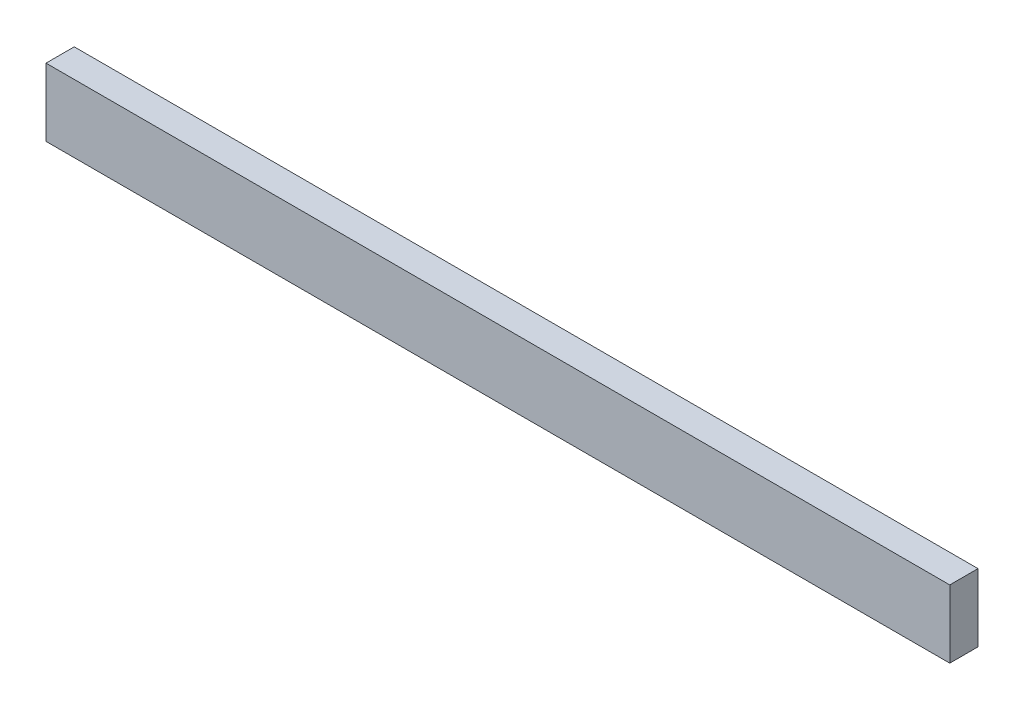
ISO-10303-21;
HEADER;
FILE_DESCRIPTION(('STEP AP214'),'2;1');
FILE_NAME('part.step','',(''),(''),'','','');
FILE_SCHEMA(('AUTOMOTIVE_DESIGN { 1 0 10303 214 1 1 1 1 }'));
ENDSEC;
DATA;
#1=APPLICATION_CONTEXT('core data for automotive mechanical design processes');
#2=APPLICATION_PROTOCOL_DEFINITION('international standard','automotive_design',2000,#1);
#3=PRODUCT_CONTEXT('',#1,'mechanical');
#4=PRODUCT('Part','Part','',(#3));
#5=PRODUCT_RELATED_PRODUCT_CATEGORY('part','',(#4));
#6=PRODUCT_DEFINITION_FORMATION('','',#4);
#7=PRODUCT_DEFINITION_CONTEXT('part definition',#1,'design');
#8=PRODUCT_DEFINITION('design','',#6,#7);
#9=PRODUCT_DEFINITION_SHAPE('','',#8);
#10=(LENGTH_UNIT() NAMED_UNIT(*) SI_UNIT(.MILLI.,.METRE.));
#11=(NAMED_UNIT(*) PLANE_ANGLE_UNIT() SI_UNIT($,.RADIAN.));
#12=(NAMED_UNIT(*) SI_UNIT($,.STERADIAN.) SOLID_ANGLE_UNIT());
#13=UNCERTAINTY_MEASURE_WITH_UNIT(LENGTH_MEASURE(1.E-05),#10,'distance_accuracy_value','');
#14=(GEOMETRIC_REPRESENTATION_CONTEXT(3) GLOBAL_UNCERTAINTY_ASSIGNED_CONTEXT((#13)) GLOBAL_UNIT_ASSIGNED_CONTEXT((#10,
#11,#12)) REPRESENTATION_CONTEXT('',''));
#15=CARTESIAN_POINT('',(0.,0.,0.));
#16=DIRECTION('',(0.,0.,1.));
#17=DIRECTION('',(1.,0.,0.));
#18=AXIS2_PLACEMENT_3D('',#15,#16,#17);
#19=CARTESIAN_POINT('',(0.,0.,25.));
#20=DIRECTION('',(1.,0.,0.));
#21=DIRECTION('',(0.,0.,-1.));
#22=AXIS2_PLACEMENT_3D('',#19,#20,#21);
#23=PLANE('',#22);
#24=DIRECTION('',(0.,-1.,0.));
#25=VECTOR('',#24,1.);
#26=CARTESIAN_POINT('',(0.,0.,0.));
#27=LINE('',#26,#25);
#28=CARTESIAN_POINT('',(0.,60.,0.));
#29=VERTEX_POINT('',#28);
#30=CARTESIAN_POINT('',(0.,0.,0.));
#31=VERTEX_POINT('',#30);
#32=EDGE_CURVE('E95',#29,#31,#27,.T.);
#33=ORIENTED_EDGE('',*,*,#32,.T.);
#34=DIRECTION('',(0.,0.,-1.));
#35=VECTOR('',#34,1.);
#36=CARTESIAN_POINT('',(0.,0.,25.));
#37=LINE('',#36,#35);
#38=CARTESIAN_POINT('',(0.,0.,25.));
#39=VERTEX_POINT('',#38);
#40=EDGE_CURVE('E11',#39,#31,#37,.T.);
#41=ORIENTED_EDGE('',*,*,#40,.F.);
#42=DIRECTION('',(0.,-1.,0.));
#43=VECTOR('',#42,1.);
#44=CARTESIAN_POINT('',(0.,0.,25.));
#45=LINE('',#44,#43);
#46=CARTESIAN_POINT('',(0.,60.,25.));
#47=VERTEX_POINT('',#46);
#48=EDGE_CURVE('E83',#47,#39,#45,.T.);
#49=ORIENTED_EDGE('',*,*,#48,.F.);
#50=DIRECTION('',(0.,0.,-1.));
#51=VECTOR('',#50,1.);
#52=CARTESIAN_POINT('',(0.,60.,25.));
#53=LINE('',#52,#51);
#54=EDGE_CURVE('E91',#47,#29,#53,.T.);
#55=ORIENTED_EDGE('',*,*,#54,.T.);
#56=EDGE_LOOP('',(#33,#41,#49,#55));
#57=FACE_BOUND('',#56,.T.);
#58=ADVANCED_FACE('F32',(#57),#23,.F.);
#59=CARTESIAN_POINT('',(0.,0.,25.));
#60=DIRECTION('',(0.,1.,0.));
#61=DIRECTION('',(0.,0.,1.));
#62=AXIS2_PLACEMENT_3D('',#59,#60,#61);
#63=PLANE('',#62);
#64=DIRECTION('',(1.,0.,0.));
#65=VECTOR('',#64,1.);
#66=CARTESIAN_POINT('',(0.,0.,0.));
#67=LINE('',#66,#65);
#68=CARTESIAN_POINT('',(800.,0.,0.));
#69=VERTEX_POINT('',#68);
#70=EDGE_CURVE('E87',#31,#69,#67,.T.);
#71=ORIENTED_EDGE('',*,*,#70,.T.);
#72=DIRECTION('',(0.,0.,-1.));
#73=VECTOR('',#72,1.);
#74=CARTESIAN_POINT('',(800.,0.,25.));
#75=LINE('',#74,#73);
#76=CARTESIAN_POINT('',(800.,0.,25.));
#77=VERTEX_POINT('',#76);
#78=EDGE_CURVE('E40',#77,#69,#75,.T.);
#79=ORIENTED_EDGE('',*,*,#78,.F.);
#80=DIRECTION('',(1.,0.,0.));
#81=VECTOR('',#80,1.);
#82=CARTESIAN_POINT('',(0.,0.,25.));
#83=LINE('',#82,#81);
#84=EDGE_CURVE('E78',#39,#77,#83,.T.);
#85=ORIENTED_EDGE('',*,*,#84,.F.);
#86=ORIENTED_EDGE('',*,*,#40,.T.);
#87=EDGE_LOOP('',(#71,#79,#85,#86));
#88=FACE_BOUND('',#87,.T.);
#89=ADVANCED_FACE('F86',(#88),#63,.F.);
#90=CARTESIAN_POINT('',(800.,0.,25.));
#91=DIRECTION('',(-1.,0.,0.));
#92=DIRECTION('',(0.,0.,1.));
#93=AXIS2_PLACEMENT_3D('',#90,#91,#92);
#94=PLANE('',#93);
#95=DIRECTION('',(0.,1.,0.));
#96=VECTOR('',#95,1.);
#97=CARTESIAN_POINT('',(800.,0.,0.));
#98=LINE('',#97,#96);
#99=CARTESIAN_POINT('',(800.,60.,0.));
#100=VERTEX_POINT('',#99);
#101=EDGE_CURVE('E65',#69,#100,#98,.T.);
#102=ORIENTED_EDGE('',*,*,#101,.T.);
#103=DIRECTION('',(0.,0.,-1.));
#104=VECTOR('',#103,1.);
#105=CARTESIAN_POINT('',(800.,60.,25.));
#106=LINE('',#105,#104);
#107=CARTESIAN_POINT('',(800.,60.,25.));
#108=VERTEX_POINT('',#107);
#109=EDGE_CURVE('E88',#108,#100,#106,.T.);
#110=ORIENTED_EDGE('',*,*,#109,.F.);
#111=DIRECTION('',(0.,1.,0.));
#112=VECTOR('',#111,1.);
#113=CARTESIAN_POINT('',(800.,0.,25.));
#114=LINE('',#113,#112);
#115=EDGE_CURVE('E81',#77,#108,#114,.T.);
#116=ORIENTED_EDGE('',*,*,#115,.F.);
#117=ORIENTED_EDGE('',*,*,#78,.T.);
#118=EDGE_LOOP('',(#102,#110,#116,#117));
#119=FACE_BOUND('',#118,.T.);
#120=ADVANCED_FACE('F89',(#119),#94,.F.);
#121=CARTESIAN_POINT('',(0.,60.,25.));
#122=DIRECTION('',(0.,-1.,0.));
#123=DIRECTION('',(0.,0.,-1.));
#124=AXIS2_PLACEMENT_3D('',#121,#122,#123);
#125=PLANE('',#124);
#126=DIRECTION('',(-1.,0.,0.));
#127=VECTOR('',#126,1.);
#128=CARTESIAN_POINT('',(0.,60.,0.));
#129=LINE('',#128,#127);
#130=EDGE_CURVE('E71',#100,#29,#129,.T.);
#131=ORIENTED_EDGE('',*,*,#130,.T.);
#132=ORIENTED_EDGE('',*,*,#54,.F.);
#133=DIRECTION('',(-1.,0.,0.));
#134=VECTOR('',#133,1.);
#135=CARTESIAN_POINT('',(0.,60.,25.));
#136=LINE('',#135,#134);
#137=EDGE_CURVE('E48',#108,#47,#136,.T.);
#138=ORIENTED_EDGE('',*,*,#137,.F.);
#139=ORIENTED_EDGE('',*,*,#109,.T.);
#140=EDGE_LOOP('',(#131,#132,#138,#139));
#141=FACE_BOUND('',#140,.T.);
#142=ADVANCED_FACE('F102',(#141),#125,.F.);
#143=CARTESIAN_POINT('',(0.,0.,25.));
#144=DIRECTION('',(0.,0.,-1.));
#145=DIRECTION('',(-1.,0.,0.));
#146=AXIS2_PLACEMENT_3D('',#143,#144,#145);
#147=PLANE('',#146);
#148=ORIENTED_EDGE('',*,*,#48,.T.);
#149=ORIENTED_EDGE('',*,*,#84,.T.);
#150=ORIENTED_EDGE('',*,*,#115,.T.);
#151=ORIENTED_EDGE('',*,*,#137,.T.);
#152=EDGE_LOOP('',(#148,#149,#150,#151));
#153=FACE_BOUND('',#152,.T.);
#154=ADVANCED_FACE('F79',(#153),#147,.F.);
#155=CARTESIAN_POINT('',(0.,0.,0.));
#156=DIRECTION('',(0.,0.,-1.));
#157=DIRECTION('',(-1.,0.,0.));
#158=AXIS2_PLACEMENT_3D('',#155,#156,#157);
#159=PLANE('',#158);
#160=ORIENTED_EDGE('',*,*,#32,.F.);
#161=ORIENTED_EDGE('',*,*,#130,.F.);
#162=ORIENTED_EDGE('',*,*,#101,.F.);
#163=ORIENTED_EDGE('',*,*,#70,.F.);
#164=EDGE_LOOP('',(#160,#161,#162,#163));
#165=FACE_BOUND('',#164,.T.);
#166=ADVANCED_FACE('F105',(#165),#159,.T.);
#167=CLOSED_SHELL('',(#58,#89,#120,#142,#154,#166));
#168=MANIFOLD_SOLID_BREP('B2',#167);
#169=ADVANCED_BREP_SHAPE_REPRESENTATION('',(#18,#168),#14);
#170=SHAPE_DEFINITION_REPRESENTATION(#9,#169);
ENDSEC;
END-ISO-10303-21;
